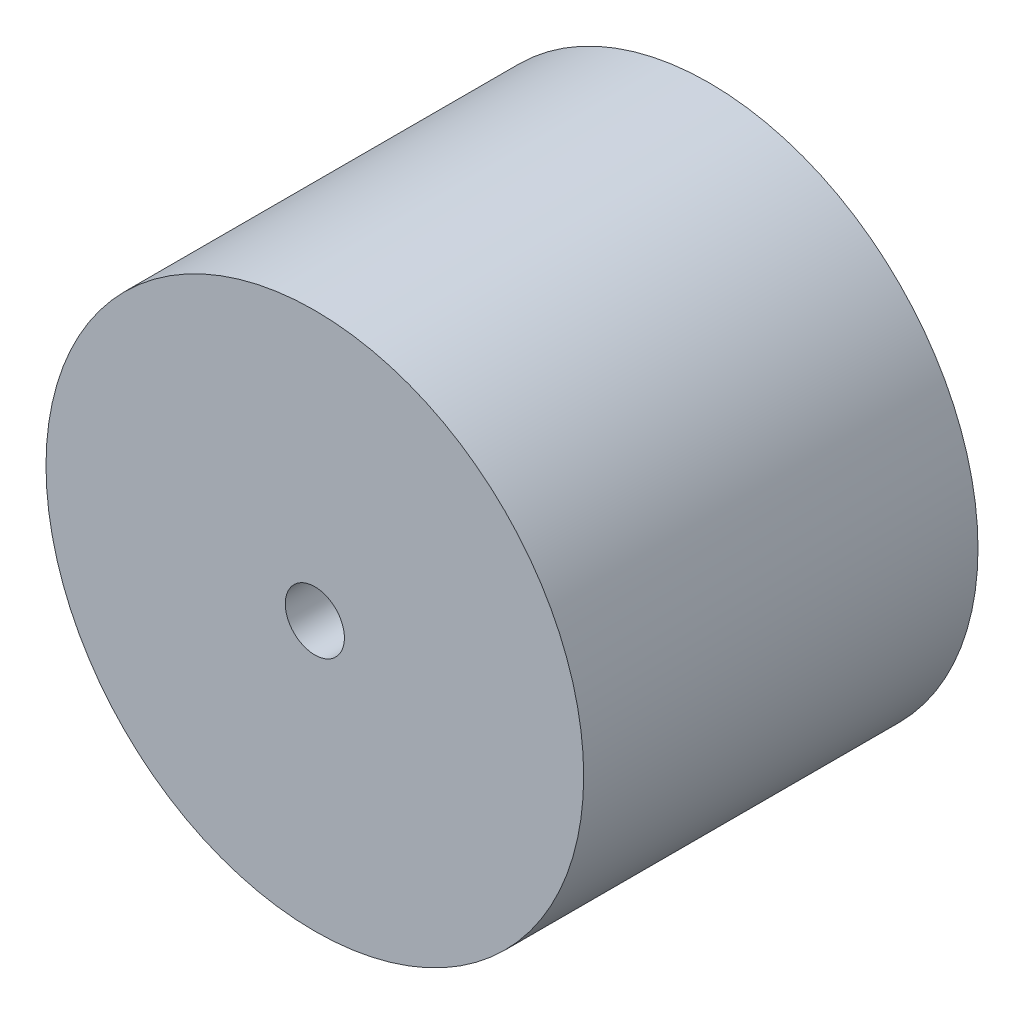
ISO-10303-21;
HEADER;
FILE_DESCRIPTION(('STEP AP214'),'2;1');
FILE_NAME('part.step','',(''),(''),'','','');
FILE_SCHEMA(('AUTOMOTIVE_DESIGN { 1 0 10303 214 1 1 1 1 }'));
ENDSEC;
DATA;
#1=APPLICATION_CONTEXT('core data for automotive mechanical design processes');
#2=APPLICATION_PROTOCOL_DEFINITION('international standard','automotive_design',2000,#1);
#3=PRODUCT_CONTEXT('',#1,'mechanical');
#4=PRODUCT('Part','Part','',(#3));
#5=PRODUCT_RELATED_PRODUCT_CATEGORY('part','',(#4));
#6=PRODUCT_DEFINITION_FORMATION('','',#4);
#7=PRODUCT_DEFINITION_CONTEXT('part definition',#1,'design');
#8=PRODUCT_DEFINITION('design','',#6,#7);
#9=PRODUCT_DEFINITION_SHAPE('','',#8);
#10=(LENGTH_UNIT() NAMED_UNIT(*) SI_UNIT(.MILLI.,.METRE.));
#11=(NAMED_UNIT(*) PLANE_ANGLE_UNIT() SI_UNIT($,.RADIAN.));
#12=(NAMED_UNIT(*) SI_UNIT($,.STERADIAN.) SOLID_ANGLE_UNIT());
#13=UNCERTAINTY_MEASURE_WITH_UNIT(LENGTH_MEASURE(1.E-05),#10,'distance_accuracy_value','');
#14=(GEOMETRIC_REPRESENTATION_CONTEXT(3) GLOBAL_UNCERTAINTY_ASSIGNED_CONTEXT((#13)) GLOBAL_UNIT_ASSIGNED_CONTEXT((#10,
#11,#12)) REPRESENTATION_CONTEXT('',''));
#15=CARTESIAN_POINT('',(0.,0.,0.));
#16=DIRECTION('',(0.,0.,1.));
#17=DIRECTION('',(1.,0.,0.));
#18=AXIS2_PLACEMENT_3D('',#15,#16,#17);
#19=CARTESIAN_POINT('',(0.,0.,22.));
#20=DIRECTION('',(0.,0.,-1.));
#21=DIRECTION('',(-1.,0.,0.));
#22=AXIS2_PLACEMENT_3D('',#19,#20,#21);
#23=CYLINDRICAL_SURFACE('',#22,15.);
#24=CARTESIAN_POINT('',(0.,0.,22.));
#25=DIRECTION('',(0.,0.,1.));
#26=DIRECTION('',(1.,0.,0.));
#27=AXIS2_PLACEMENT_3D('',#24,#25,#26);
#28=CIRCLE('',#27,15.);
#29=CARTESIAN_POINT('',(15.,0.,22.));
#30=VERTEX_POINT('',#29);
#31=EDGE_CURVE('E11',#30,#30,#28,.T.);
#32=ORIENTED_EDGE('',*,*,#31,.F.);
#33=EDGE_LOOP('',(#32));
#34=FACE_BOUND('',#33,.T.);
#35=CARTESIAN_POINT('',(0.,0.,0.));
#36=DIRECTION('',(0.,0.,1.));
#37=DIRECTION('',(1.,0.,0.));
#38=AXIS2_PLACEMENT_3D('',#35,#36,#37);
#39=CIRCLE('',#38,15.);
#40=CARTESIAN_POINT('',(15.,0.,0.));
#41=VERTEX_POINT('',#40);
#42=EDGE_CURVE('E20',#41,#41,#39,.T.);
#43=ORIENTED_EDGE('',*,*,#42,.T.);
#44=EDGE_LOOP('',(#43));
#45=FACE_BOUND('',#44,.T.);
#46=ADVANCED_FACE('F17',(#34,#45),#23,.T.);
#47=CARTESIAN_POINT('',(0.,0.,22.));
#48=DIRECTION('',(0.,0.,1.));
#49=DIRECTION('',(1.,0.,0.));
#50=AXIS2_PLACEMENT_3D('',#47,#48,#49);
#51=PLANE('',#50);
#52=CARTESIAN_POINT('',(0.,0.,22.));
#53=DIRECTION('',(0.,0.,1.));
#54=DIRECTION('',(1.,0.,0.));
#55=AXIS2_PLACEMENT_3D('',#52,#53,#54);
#56=CIRCLE('',#55,1.65);
#57=CARTESIAN_POINT('',(1.65,0.,22.));
#58=VERTEX_POINT('',#57);
#59=EDGE_CURVE('E36',#58,#58,#56,.T.);
#60=ORIENTED_EDGE('',*,*,#59,.F.);
#61=EDGE_LOOP('',(#60));
#62=FACE_BOUND('',#61,.T.);
#63=ORIENTED_EDGE('',*,*,#31,.T.);
#64=EDGE_LOOP('',(#63));
#65=FACE_BOUND('',#64,.T.);
#66=ADVANCED_FACE('F44',(#62,#65),#51,.T.);
#67=CARTESIAN_POINT('',(0.,0.,0.));
#68=DIRECTION('',(0.,0.,1.));
#69=DIRECTION('',(1.,0.,0.));
#70=AXIS2_PLACEMENT_3D('',#67,#68,#69);
#71=PLANE('',#70);
#72=ORIENTED_EDGE('',*,*,#42,.F.);
#73=EDGE_LOOP('',(#72));
#74=FACE_BOUND('',#73,.T.);
#75=ADVANCED_FACE('F30',(#74),#71,.F.);
#76=CARTESIAN_POINT('',(0.,0.,11.9));
#77=DIRECTION('',(0.,0.,1.));
#78=DIRECTION('',(1.,0.,0.));
#79=AXIS2_PLACEMENT_3D('',#76,#77,#78);
#80=CONICAL_SURFACE('',#79,1.65,1.02974425867665);
#81=CARTESIAN_POINT('',(0.,0.,10.9085799786045));
#82=VERTEX_POINT('',#81);
#83=VERTEX_LOOP('',#82);
#84=FACE_BOUND('',#83,.T.);
#85=CARTESIAN_POINT('',(0.,0.,11.9));
#86=DIRECTION('',(0.,0.,1.));
#87=DIRECTION('',(1.,0.,0.));
#88=AXIS2_PLACEMENT_3D('',#85,#86,#87);
#89=CIRCLE('',#88,1.65);
#90=CARTESIAN_POINT('',(1.65,0.,11.9));
#91=VERTEX_POINT('',#90);
#92=EDGE_CURVE('E34',#91,#91,#89,.T.);
#93=ORIENTED_EDGE('',*,*,#92,.T.);
#94=EDGE_LOOP('',(#93));
#95=FACE_BOUND('',#94,.T.);
#96=ADVANCED_FACE('F26',(#84,#95),#80,.F.);
#97=CARTESIAN_POINT('',(0.,0.,22.));
#98=DIRECTION('',(0.,0.,1.));
#99=DIRECTION('',(1.,0.,0.));
#100=AXIS2_PLACEMENT_3D('',#97,#98,#99);
#101=CYLINDRICAL_SURFACE('',#100,1.65);
#102=ORIENTED_EDGE('',*,*,#92,.F.);
#103=EDGE_LOOP('',(#102));
#104=FACE_BOUND('',#103,.T.);
#105=ORIENTED_EDGE('',*,*,#59,.T.);
#106=EDGE_LOOP('',(#105));
#107=FACE_BOUND('',#106,.T.);
#108=ADVANCED_FACE('F29',(#104,#107),#101,.F.);
#109=CLOSED_SHELL('',(#46,#66,#75,#96,#108));
#110=MANIFOLD_SOLID_BREP('B1',#109);
#111=ADVANCED_BREP_SHAPE_REPRESENTATION('',(#18,#110),#14);
#112=SHAPE_DEFINITION_REPRESENTATION(#9,#111);
ENDSEC;
END-ISO-10303-21;
